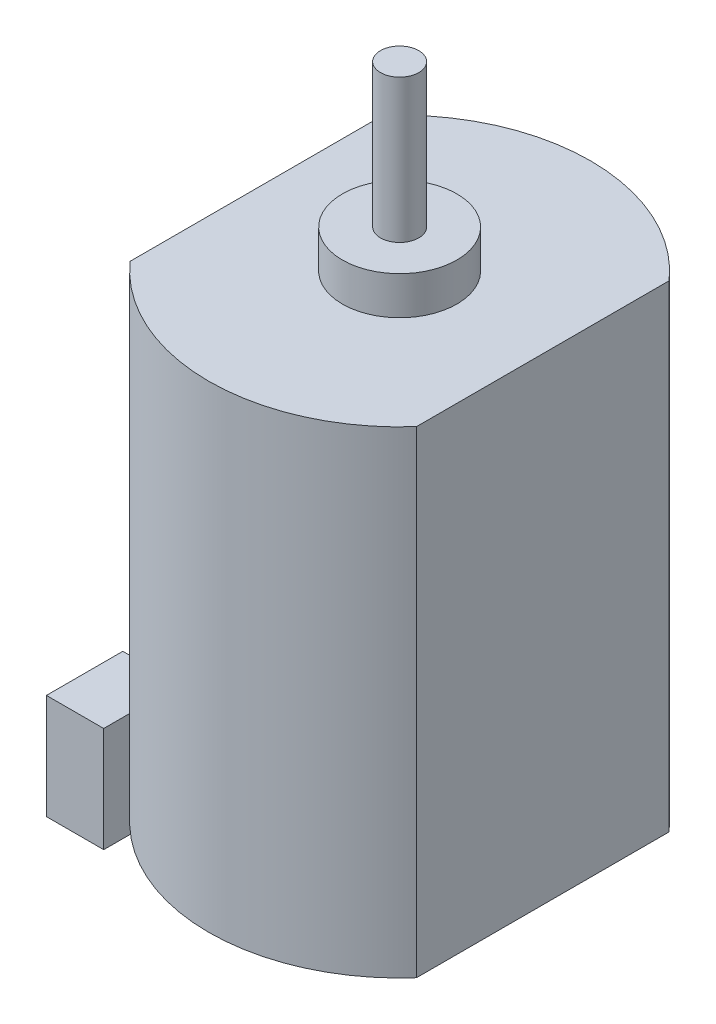
ISO-10303-21;
HEADER;
FILE_DESCRIPTION(('STEP AP214'),'2;1');
FILE_NAME('part.step','',(''),(''),'','','');
FILE_SCHEMA(('AUTOMOTIVE_DESIGN { 1 0 10303 214 1 1 1 1 }'));
ENDSEC;
DATA;
#1=APPLICATION_CONTEXT('core data for automotive mechanical design processes');
#2=APPLICATION_PROTOCOL_DEFINITION('international standard','automotive_design',2000,#1);
#3=PRODUCT_CONTEXT('',#1,'mechanical');
#4=PRODUCT('Part','Part','',(#3));
#5=PRODUCT_RELATED_PRODUCT_CATEGORY('part','',(#4));
#6=PRODUCT_DEFINITION_FORMATION('','',#4);
#7=PRODUCT_DEFINITION_CONTEXT('part definition',#1,'design');
#8=PRODUCT_DEFINITION('design','',#6,#7);
#9=PRODUCT_DEFINITION_SHAPE('','',#8);
#10=(LENGTH_UNIT() NAMED_UNIT(*) SI_UNIT(.MILLI.,.METRE.));
#11=(NAMED_UNIT(*) PLANE_ANGLE_UNIT() SI_UNIT($,.RADIAN.));
#12=(NAMED_UNIT(*) SI_UNIT($,.STERADIAN.) SOLID_ANGLE_UNIT());
#13=UNCERTAINTY_MEASURE_WITH_UNIT(LENGTH_MEASURE(1.E-05),#10,'distance_accuracy_value','');
#14=(GEOMETRIC_REPRESENTATION_CONTEXT(3) GLOBAL_UNCERTAINTY_ASSIGNED_CONTEXT((#13)) GLOBAL_UNIT_ASSIGNED_CONTEXT((#10,
#11,#12)) REPRESENTATION_CONTEXT('',''));
#15=CARTESIAN_POINT('',(0.,0.,0.));
#16=DIRECTION('',(0.,0.,1.));
#17=DIRECTION('',(1.,0.,0.));
#18=AXIS2_PLACEMENT_3D('',#15,#16,#17);
#19=CARTESIAN_POINT('',(-7.5,25.001,10.));
#20=DIRECTION('',(1.,0.,0.));
#21=DIRECTION('',(0.,0.,-1.));
#22=AXIS2_PLACEMENT_3D('',#19,#20,#21);
#23=PLANE('',#22);
#24=DIRECTION('',(0.,0.,-1.));
#25=VECTOR('',#24,1.);
#26=CARTESIAN_POINT('',(-7.5,4.5,4.));
#27=LINE('',#26,#25);
#28=CARTESIAN_POINT('',(-7.5,4.5,6.61437827766148));
#29=VERTEX_POINT('',#28);
#30=CARTESIAN_POINT('',(-7.5,4.5,4.));
#31=VERTEX_POINT('',#30);
#32=EDGE_CURVE('E53',#29,#31,#27,.T.);
#33=ORIENTED_EDGE('',*,*,#32,.F.);
#34=DIRECTION('',(0.,-1.,0.));
#35=VECTOR('',#34,1.);
#36=CARTESIAN_POINT('',(-7.5,25.,6.61437827766148));
#37=LINE('',#36,#35);
#38=CARTESIAN_POINT('',(-7.5,25.,6.61437827766148));
#39=VERTEX_POINT('',#38);
#40=EDGE_CURVE('E237',#29,#39,#37,.F.);
#41=ORIENTED_EDGE('',*,*,#40,.T.);
#42=DIRECTION('',(0.,0.,1.));
#43=VECTOR('',#42,1.);
#44=CARTESIAN_POINT('',(-7.5,25.,10.));
#45=LINE('',#44,#43);
#46=CARTESIAN_POINT('',(-7.5,25.,-6.61437827766148));
#47=VERTEX_POINT('',#46);
#48=EDGE_CURVE('E242',#47,#39,#45,.T.);
#49=ORIENTED_EDGE('',*,*,#48,.F.);
#50=DIRECTION('',(0.,-1.,0.));
#51=VECTOR('',#50,1.);
#52=CARTESIAN_POINT('',(-7.5,25.,-6.61437827766148));
#53=LINE('',#52,#51);
#54=CARTESIAN_POINT('',(-7.5,4.5,-6.61437827766148));
#55=VERTEX_POINT('',#54);
#56=EDGE_CURVE('E234',#47,#55,#53,.T.);
#57=ORIENTED_EDGE('',*,*,#56,.T.);
#58=DIRECTION('',(0.,0.,-1.));
#59=VECTOR('',#58,1.);
#60=CARTESIAN_POINT('',(-7.5,4.5,-8.));
#61=LINE('',#60,#59);
#62=CARTESIAN_POINT('',(-7.5,4.5,-4.));
#63=VERTEX_POINT('',#62);
#64=EDGE_CURVE('E192',#63,#55,#61,.T.);
#65=ORIENTED_EDGE('',*,*,#64,.F.);
#66=DIRECTION('',(0.,1.,0.));
#67=VECTOR('',#66,1.);
#68=CARTESIAN_POINT('',(-7.5,4.5,-4.));
#69=LINE('',#68,#67);
#70=CARTESIAN_POINT('',(-7.5,0.,-4.));
#71=VERTEX_POINT('',#70);
#72=EDGE_CURVE('E11',#71,#63,#69,.T.);
#73=ORIENTED_EDGE('',*,*,#72,.F.);
#74=DIRECTION('',(0.,0.,1.));
#75=VECTOR('',#74,1.);
#76=CARTESIAN_POINT('',(-7.5,0.,10.));
#77=LINE('',#76,#75);
#78=CARTESIAN_POINT('',(-7.5,0.,4.));
#79=VERTEX_POINT('',#78);
#80=EDGE_CURVE('E250',#71,#79,#77,.T.);
#81=ORIENTED_EDGE('',*,*,#80,.T.);
#82=DIRECTION('',(0.,-1.,0.));
#83=VECTOR('',#82,1.);
#84=CARTESIAN_POINT('',(-7.5,3.,4.));
#85=LINE('',#84,#83);
#86=EDGE_CURVE('E49',#31,#79,#85,.T.);
#87=ORIENTED_EDGE('',*,*,#86,.F.);
#88=EDGE_LOOP('',(#33,#41,#49,#57,#65,#73,#81,#87));
#89=FACE_BOUND('',#88,.T.);
#90=ADVANCED_FACE('F32',(#89),#23,.F.);
#91=CARTESIAN_POINT('',(0.,25.,0.));
#92=DIRECTION('',(0.,-1.,0.));
#93=DIRECTION('',(0.,0.,-1.));
#94=AXIS2_PLACEMENT_3D('',#91,#92,#93);
#95=CYLINDRICAL_SURFACE('',#94,10.);
#96=CARTESIAN_POINT('',(0.,25.,0.));
#97=DIRECTION('',(0.,1.,0.));
#98=DIRECTION('',(0.,0.,1.));
#99=AXIS2_PLACEMENT_3D('',#96,#97,#98);
#100=CIRCLE('',#99,10.);
#101=CARTESIAN_POINT('',(7.5,25.,6.61437827766148));
#102=VERTEX_POINT('',#101);
#103=EDGE_CURVE('E259',#39,#102,#100,.T.);
#104=ORIENTED_EDGE('',*,*,#103,.F.);
#105=ORIENTED_EDGE('',*,*,#40,.F.);
#106=CARTESIAN_POINT('',(-7.5,0.,6.61437827766148));
#107=VERTEX_POINT('',#106);
#108=EDGE_CURVE('E239',#107,#29,#37,.F.);
#109=ORIENTED_EDGE('',*,*,#108,.F.);
#110=CARTESIAN_POINT('',(0.,0.,0.));
#111=DIRECTION('',(0.,1.,0.));
#112=DIRECTION('',(0.,0.,1.));
#113=AXIS2_PLACEMENT_3D('',#110,#111,#112);
#114=CIRCLE('',#113,10.);
#115=CARTESIAN_POINT('',(7.5,0.,6.61437827766148));
#116=VERTEX_POINT('',#115);
#117=EDGE_CURVE('E249',#107,#116,#114,.T.);
#118=ORIENTED_EDGE('',*,*,#117,.T.);
#119=DIRECTION('',(0.,-1.,0.));
#120=VECTOR('',#119,1.);
#121=CARTESIAN_POINT('',(7.5,25.,6.61437827766148));
#122=LINE('',#121,#120);
#123=EDGE_CURVE('E228',#102,#116,#122,.T.);
#124=ORIENTED_EDGE('',*,*,#123,.F.);
#125=EDGE_LOOP('',(#104,#105,#109,#118,#124));
#126=FACE_BOUND('',#125,.T.);
#127=ADVANCED_FACE('F300',(#126),#95,.T.);
#128=CARTESIAN_POINT('',(7.5,0.,-6.61437827766148));
#129=VERTEX_POINT('',#128);
#130=CARTESIAN_POINT('',(-7.5,0.,-6.61437827766148));
#131=VERTEX_POINT('',#130);
#132=EDGE_CURVE('E262',#129,#131,#114,.T.);
#133=ORIENTED_EDGE('',*,*,#132,.T.);
#134=EDGE_CURVE('E238',#55,#131,#53,.T.);
#135=ORIENTED_EDGE('',*,*,#134,.F.);
#136=ORIENTED_EDGE('',*,*,#56,.F.);
#137=CARTESIAN_POINT('',(7.5,25.,-6.61437827766148));
#138=VERTEX_POINT('',#137);
#139=EDGE_CURVE('E233',#138,#47,#100,.T.);
#140=ORIENTED_EDGE('',*,*,#139,.F.);
#141=DIRECTION('',(0.,-1.,0.));
#142=VECTOR('',#141,1.);
#143=CARTESIAN_POINT('',(7.5,25.,-6.61437827766148));
#144=LINE('',#143,#142);
#145=EDGE_CURVE('E252',#129,#138,#144,.F.);
#146=ORIENTED_EDGE('',*,*,#145,.F.);
#147=EDGE_LOOP('',(#133,#135,#136,#140,#146));
#148=FACE_BOUND('',#147,.T.);
#149=ADVANCED_FACE('F34',(#148),#95,.T.);
#150=CARTESIAN_POINT('',(0.,25.,0.));
#151=DIRECTION('',(0.,1.,0.));
#152=DIRECTION('',(0.,0.,1.));
#153=AXIS2_PLACEMENT_3D('',#150,#151,#152);
#154=PLANE('',#153);
#155=ORIENTED_EDGE('',*,*,#48,.T.);
#156=ORIENTED_EDGE('',*,*,#103,.T.);
#157=DIRECTION('',(0.,0.,-1.));
#158=VECTOR('',#157,1.);
#159=CARTESIAN_POINT('',(7.5,25.,10.));
#160=LINE('',#159,#158);
#161=EDGE_CURVE('E254',#102,#138,#160,.T.);
#162=ORIENTED_EDGE('',*,*,#161,.T.);
#163=ORIENTED_EDGE('',*,*,#139,.T.);
#164=EDGE_LOOP('',(#155,#156,#162,#163));
#165=FACE_BOUND('',#164,.T.);
#166=CARTESIAN_POINT('',(0.,25.,0.));
#167=DIRECTION('',(0.,1.,0.));
#168=DIRECTION('',(0.,0.,1.));
#169=AXIS2_PLACEMENT_3D('',#166,#167,#168);
#170=CIRCLE('',#169,3.);
#171=CARTESIAN_POINT('',(0.,25.,3.));
#172=VERTEX_POINT('',#171);
#173=EDGE_CURVE('E229',#172,#172,#170,.T.);
#174=ORIENTED_EDGE('',*,*,#173,.F.);
#175=EDGE_LOOP('',(#174));
#176=FACE_BOUND('',#175,.T.);
#177=ADVANCED_FACE('F291',(#165,#176),#154,.T.);
#178=CARTESIAN_POINT('',(0.,0.,0.));
#179=DIRECTION('',(0.,1.,0.));
#180=DIRECTION('',(0.,0.,1.));
#181=AXIS2_PLACEMENT_3D('',#178,#179,#180);
#182=PLANE('',#181);
#183=DIRECTION('',(0.,0.,-1.));
#184=VECTOR('',#183,1.);
#185=CARTESIAN_POINT('',(4.,0.,0.));
#186=LINE('',#185,#184);
#187=CARTESIAN_POINT('',(4.,0.,3.));
#188=VERTEX_POINT('',#187);
#189=CARTESIAN_POINT('',(4.,0.,-3.));
#190=VERTEX_POINT('',#189);
#191=EDGE_CURVE('E232',#188,#190,#186,.T.);
#192=ORIENTED_EDGE('',*,*,#191,.T.);
#193=CARTESIAN_POINT('',(0.,0.,0.));
#194=DIRECTION('',(0.,1.,0.));
#195=DIRECTION('',(0.,0.,1.));
#196=AXIS2_PLACEMENT_3D('',#193,#194,#195);
#197=CIRCLE('',#196,5.);
#198=EDGE_CURVE('E268',#190,#188,#197,.T.);
#199=ORIENTED_EDGE('',*,*,#198,.T.);
#200=EDGE_LOOP('',(#192,#199));
#201=FACE_BOUND('',#200,.T.);
#202=ORIENTED_EDGE('',*,*,#117,.F.);
#203=EDGE_CURVE('E245',#79,#107,#77,.T.);
#204=ORIENTED_EDGE('',*,*,#203,.F.);
#205=ORIENTED_EDGE('',*,*,#80,.F.);
#206=EDGE_CURVE('E246',#131,#71,#77,.T.);
#207=ORIENTED_EDGE('',*,*,#206,.F.);
#208=ORIENTED_EDGE('',*,*,#132,.F.);
#209=DIRECTION('',(0.,0.,-1.));
#210=VECTOR('',#209,1.);
#211=CARTESIAN_POINT('',(7.5,0.,10.));
#212=LINE('',#211,#210);
#213=EDGE_CURVE('E257',#116,#129,#212,.T.);
#214=ORIENTED_EDGE('',*,*,#213,.F.);
#215=EDGE_LOOP('',(#202,#204,#205,#207,#208,#214));
#216=FACE_BOUND('',#215,.T.);
#217=ADVANCED_FACE('F287',(#201,#216),#182,.F.);
#218=CARTESIAN_POINT('',(7.5,25.001,10.));
#219=DIRECTION('',(-1.,0.,0.));
#220=DIRECTION('',(0.,0.,1.));
#221=AXIS2_PLACEMENT_3D('',#218,#219,#220);
#222=PLANE('',#221);
#223=ORIENTED_EDGE('',*,*,#145,.T.);
#224=ORIENTED_EDGE('',*,*,#161,.F.);
#225=ORIENTED_EDGE('',*,*,#123,.T.);
#226=ORIENTED_EDGE('',*,*,#213,.T.);
#227=EDGE_LOOP('',(#223,#224,#225,#226));
#228=FACE_BOUND('',#227,.T.);
#229=ADVANCED_FACE('F290',(#228),#222,.F.);
#230=CARTESIAN_POINT('',(0.,27.,0.));
#231=DIRECTION('',(0.,-1.,0.));
#232=DIRECTION('',(0.,0.,-1.));
#233=AXIS2_PLACEMENT_3D('',#230,#231,#232);
#234=CYLINDRICAL_SURFACE('',#233,3.);
#235=CARTESIAN_POINT('',(0.,27.,0.));
#236=DIRECTION('',(0.,1.,0.));
#237=DIRECTION('',(0.,0.,1.));
#238=AXIS2_PLACEMENT_3D('',#235,#236,#237);
#239=CIRCLE('',#238,3.);
#240=CARTESIAN_POINT('',(0.,27.,3.));
#241=VERTEX_POINT('',#240);
#242=EDGE_CURVE('E225',#241,#241,#239,.T.);
#243=ORIENTED_EDGE('',*,*,#242,.F.);
#244=EDGE_LOOP('',(#243));
#245=FACE_BOUND('',#244,.T.);
#246=ORIENTED_EDGE('',*,*,#173,.T.);
#247=EDGE_LOOP('',(#246));
#248=FACE_BOUND('',#247,.T.);
#249=ADVANCED_FACE('F337',(#245,#248),#234,.T.);
#250=CARTESIAN_POINT('',(0.,27.,0.));
#251=DIRECTION('',(0.,1.,0.));
#252=DIRECTION('',(0.,0.,1.));
#253=AXIS2_PLACEMENT_3D('',#250,#251,#252);
#254=PLANE('',#253);
#255=CARTESIAN_POINT('',(0.,27.,0.));
#256=DIRECTION('',(0.,1.,0.));
#257=DIRECTION('',(0.,0.,1.));
#258=AXIS2_PLACEMENT_3D('',#255,#256,#257);
#259=CIRCLE('',#258,1.);
#260=CARTESIAN_POINT('',(0.,27.,1.));
#261=VERTEX_POINT('',#260);
#262=EDGE_CURVE('E224',#261,#261,#259,.F.);
#263=ORIENTED_EDGE('',*,*,#262,.T.);
#264=EDGE_LOOP('',(#263));
#265=FACE_BOUND('',#264,.T.);
#266=ORIENTED_EDGE('',*,*,#242,.T.);
#267=EDGE_LOOP('',(#266));
#268=FACE_BOUND('',#267,.T.);
#269=ADVANCED_FACE('F342',(#265,#268),#254,.T.);
#270=CARTESIAN_POINT('',(0.,34.5,0.));
#271=DIRECTION('',(0.,-1.,0.));
#272=DIRECTION('',(0.,0.,-1.));
#273=AXIS2_PLACEMENT_3D('',#270,#271,#272);
#274=CYLINDRICAL_SURFACE('',#273,1.);
#275=ORIENTED_EDGE('',*,*,#262,.F.);
#276=EDGE_LOOP('',(#275));
#277=FACE_BOUND('',#276,.T.);
#278=CARTESIAN_POINT('',(0.,34.5,0.));
#279=DIRECTION('',(0.,1.,0.));
#280=DIRECTION('',(0.,0.,1.));
#281=AXIS2_PLACEMENT_3D('',#278,#279,#280);
#282=CIRCLE('',#281,1.);
#283=CARTESIAN_POINT('',(0.,34.5,1.));
#284=VERTEX_POINT('',#283);
#285=EDGE_CURVE('E219',#284,#284,#282,.T.);
#286=ORIENTED_EDGE('',*,*,#285,.F.);
#287=EDGE_LOOP('',(#286));
#288=FACE_BOUND('',#287,.T.);
#289=ADVANCED_FACE('F354',(#277,#288),#274,.T.);
#290=CARTESIAN_POINT('',(0.,34.5,0.));
#291=DIRECTION('',(0.,1.,0.));
#292=DIRECTION('',(0.,0.,1.));
#293=AXIS2_PLACEMENT_3D('',#290,#291,#292);
#294=PLANE('',#293);
#295=ORIENTED_EDGE('',*,*,#285,.T.);
#296=EDGE_LOOP('',(#295));
#297=FACE_BOUND('',#296,.T.);
#298=ADVANCED_FACE('F358',(#297),#294,.T.);
#299=CARTESIAN_POINT('',(0.,-2.3,0.));
#300=DIRECTION('',(0.,1.,0.));
#301=DIRECTION('',(0.,0.,1.));
#302=AXIS2_PLACEMENT_3D('',#299,#300,#301);
#303=CYLINDRICAL_SURFACE('',#302,5.);
#304=ORIENTED_EDGE('',*,*,#198,.F.);
#305=DIRECTION('',(0.,1.,0.));
#306=VECTOR('',#305,1.);
#307=CARTESIAN_POINT('',(4.,-2.3,-3.));
#308=LINE('',#307,#306);
#309=CARTESIAN_POINT('',(4.,-2.3,-3.));
#310=VERTEX_POINT('',#309);
#311=EDGE_CURVE('E217',#310,#190,#308,.T.);
#312=ORIENTED_EDGE('',*,*,#311,.F.);
#313=CARTESIAN_POINT('',(0.,-2.3,0.));
#314=DIRECTION('',(0.,1.,0.));
#315=DIRECTION('',(0.,0.,1.));
#316=AXIS2_PLACEMENT_3D('',#313,#314,#315);
#317=CIRCLE('',#316,5.);
#318=CARTESIAN_POINT('',(4.,-2.3,3.));
#319=VERTEX_POINT('',#318);
#320=EDGE_CURVE('E210',#310,#319,#317,.T.);
#321=ORIENTED_EDGE('',*,*,#320,.T.);
#322=DIRECTION('',(0.,1.,0.));
#323=VECTOR('',#322,1.);
#324=CARTESIAN_POINT('',(4.,-2.3,3.));
#325=LINE('',#324,#323);
#326=EDGE_CURVE('E216',#319,#188,#325,.T.);
#327=ORIENTED_EDGE('',*,*,#326,.T.);
#328=EDGE_LOOP('',(#304,#312,#321,#327));
#329=FACE_BOUND('',#328,.T.);
#330=ADVANCED_FACE('F286',(#329),#303,.T.);
#331=CARTESIAN_POINT('',(4.,-2.3,0.));
#332=DIRECTION('',(1.,0.,0.));
#333=DIRECTION('',(0.,0.,-1.));
#334=AXIS2_PLACEMENT_3D('',#331,#332,#333);
#335=PLANE('',#334);
#336=ORIENTED_EDGE('',*,*,#191,.F.);
#337=ORIENTED_EDGE('',*,*,#326,.F.);
#338=DIRECTION('',(0.,0.,-1.));
#339=VECTOR('',#338,1.);
#340=CARTESIAN_POINT('',(4.,-2.3,0.));
#341=LINE('',#340,#339);
#342=EDGE_CURVE('E213',#319,#310,#341,.T.);
#343=ORIENTED_EDGE('',*,*,#342,.T.);
#344=ORIENTED_EDGE('',*,*,#311,.T.);
#345=EDGE_LOOP('',(#336,#337,#343,#344));
#346=FACE_BOUND('',#345,.T.);
#347=ADVANCED_FACE('F280',(#346),#335,.T.);
#348=CARTESIAN_POINT('',(0.,-2.3,0.));
#349=DIRECTION('',(0.,1.,0.));
#350=DIRECTION('',(0.,0.,1.));
#351=AXIS2_PLACEMENT_3D('',#348,#349,#350);
#352=PLANE('',#351);
#353=CARTESIAN_POINT('',(0.,-2.3,0.));
#354=DIRECTION('',(0.,1.,0.));
#355=DIRECTION('',(0.,0.,1.));
#356=AXIS2_PLACEMENT_3D('',#353,#354,#355);
#357=CIRCLE('',#356,1.);
#358=CARTESIAN_POINT('',(0.,-2.3,1.));
#359=VERTEX_POINT('',#358);
#360=EDGE_CURVE('E36',#359,#359,#357,.F.);
#361=ORIENTED_EDGE('',*,*,#360,.F.);
#362=EDGE_LOOP('',(#361));
#363=FACE_BOUND('',#362,.T.);
#364=ORIENTED_EDGE('',*,*,#320,.F.);
#365=ORIENTED_EDGE('',*,*,#342,.F.);
#366=EDGE_LOOP('',(#364,#365));
#367=FACE_BOUND('',#366,.T.);
#368=ADVANCED_FACE('F277',(#363,#367),#352,.F.);
#369=CARTESIAN_POINT('',(0.,-3.3,0.));
#370=DIRECTION('',(0.,1.,0.));
#371=DIRECTION('',(0.,0.,1.));
#372=AXIS2_PLACEMENT_3D('',#369,#370,#371);
#373=CYLINDRICAL_SURFACE('',#372,1.);
#374=CARTESIAN_POINT('',(0.,-3.3,0.));
#375=DIRECTION('',(0.,-1.,0.));
#376=DIRECTION('',(0.,0.,-1.));
#377=AXIS2_PLACEMENT_3D('',#374,#375,#376);
#378=CIRCLE('',#377,1.);
#379=CARTESIAN_POINT('',(0.,-3.3,-1.));
#380=VERTEX_POINT('',#379);
#381=EDGE_CURVE('E207',#380,#380,#378,.T.);
#382=ORIENTED_EDGE('',*,*,#381,.F.);
#383=EDGE_LOOP('',(#382));
#384=FACE_BOUND('',#383,.T.);
#385=ORIENTED_EDGE('',*,*,#360,.T.);
#386=EDGE_LOOP('',(#385));
#387=FACE_BOUND('',#386,.T.);
#388=ADVANCED_FACE('F275',(#384,#387),#373,.T.);
#389=CARTESIAN_POINT('',(0.,-3.3,0.));
#390=DIRECTION('',(0.,-1.,0.));
#391=DIRECTION('',(0.,0.,-1.));
#392=AXIS2_PLACEMENT_3D('',#389,#390,#391);
#393=PLANE('',#392);
#394=ORIENTED_EDGE('',*,*,#381,.T.);
#395=EDGE_LOOP('',(#394));
#396=FACE_BOUND('',#395,.T.);
#397=ADVANCED_FACE('F369',(#396),#393,.T.);
#398=CARTESIAN_POINT('',(-7.5,0.,0.));
#399=DIRECTION('',(-1.,0.,0.));
#400=DIRECTION('',(0.,0.,1.));
#401=AXIS2_PLACEMENT_3D('',#398,#399,#400);
#402=PLANE('',#401);
#403=CARTESIAN_POINT('',(-7.5,4.5,-8.));
#404=VERTEX_POINT('',#403);
#405=EDGE_CURVE('E191',#55,#404,#61,.T.);
#406=ORIENTED_EDGE('',*,*,#405,.F.);
#407=ORIENTED_EDGE('',*,*,#134,.T.);
#408=ORIENTED_EDGE('',*,*,#206,.T.);
#409=CARTESIAN_POINT('',(-7.5,-1.,-4.));
#410=VERTEX_POINT('',#409);
#411=EDGE_CURVE('E42',#410,#71,#69,.T.);
#412=ORIENTED_EDGE('',*,*,#411,.F.);
#413=DIRECTION('',(0.,0.,1.));
#414=VECTOR('',#413,1.);
#415=CARTESIAN_POINT('',(-7.5,-1.,-8.));
#416=LINE('',#415,#414);
#417=CARTESIAN_POINT('',(-7.5,-1.,-8.));
#418=VERTEX_POINT('',#417);
#419=EDGE_CURVE('E170',#418,#410,#416,.T.);
#420=ORIENTED_EDGE('',*,*,#419,.F.);
#421=DIRECTION('',(0.,-1.,0.));
#422=VECTOR('',#421,1.);
#423=CARTESIAN_POINT('',(-7.5,3.,-8.));
#424=LINE('',#423,#422);
#425=EDGE_CURVE('E182',#404,#418,#424,.T.);
#426=ORIENTED_EDGE('',*,*,#425,.F.);
#427=EDGE_LOOP('',(#406,#407,#408,#412,#420,#426));
#428=FACE_BOUND('',#427,.T.);
#429=ADVANCED_FACE('F311',(#428),#402,.F.);
#430=CARTESIAN_POINT('',(-10.5,-1.,-8.));
#431=DIRECTION('',(0.,1.,0.));
#432=DIRECTION('',(0.,0.,1.));
#433=AXIS2_PLACEMENT_3D('',#430,#431,#432);
#434=PLANE('',#433);
#435=ORIENTED_EDGE('',*,*,#419,.T.);
#436=DIRECTION('',(1.,0.,0.));
#437=VECTOR('',#436,1.);
#438=CARTESIAN_POINT('',(-10.5,-1.,-4.));
#439=LINE('',#438,#437);
#440=CARTESIAN_POINT('',(-10.5,-1.,-4.));
#441=VERTEX_POINT('',#440);
#442=EDGE_CURVE('E201',#441,#410,#439,.T.);
#443=ORIENTED_EDGE('',*,*,#442,.F.);
#444=DIRECTION('',(0.,0.,1.));
#445=VECTOR('',#444,1.);
#446=CARTESIAN_POINT('',(-10.5,-1.,-8.));
#447=LINE('',#446,#445);
#448=CARTESIAN_POINT('',(-10.5,-1.,-8.));
#449=VERTEX_POINT('',#448);
#450=EDGE_CURVE('E181',#449,#441,#447,.T.);
#451=ORIENTED_EDGE('',*,*,#450,.F.);
#452=DIRECTION('',(1.,0.,0.));
#453=VECTOR('',#452,1.);
#454=CARTESIAN_POINT('',(-10.5,-1.,-8.));
#455=LINE('',#454,#453);
#456=EDGE_CURVE('E204',#449,#418,#455,.T.);
#457=ORIENTED_EDGE('',*,*,#456,.T.);
#458=EDGE_LOOP('',(#435,#443,#451,#457));
#459=FACE_BOUND('',#458,.T.);
#460=ADVANCED_FACE('F319',(#459),#434,.F.);
#461=CARTESIAN_POINT('',(-10.5,4.5,-4.));
#462=DIRECTION('',(0.,0.,-1.));
#463=DIRECTION('',(0.,1.,0.));
#464=AXIS2_PLACEMENT_3D('',#461,#462,#463);
#465=PLANE('',#464);
#466=ORIENTED_EDGE('',*,*,#411,.T.);
#467=ORIENTED_EDGE('',*,*,#72,.T.);
#468=DIRECTION('',(1.,0.,0.));
#469=VECTOR('',#468,1.);
#470=CARTESIAN_POINT('',(-10.5,4.5,-4.));
#471=LINE('',#470,#469);
#472=CARTESIAN_POINT('',(-10.5,4.5,-4.));
#473=VERTEX_POINT('',#472);
#474=EDGE_CURVE('E198',#473,#63,#471,.T.);
#475=ORIENTED_EDGE('',*,*,#474,.F.);
#476=DIRECTION('',(0.,1.,0.));
#477=VECTOR('',#476,1.);
#478=CARTESIAN_POINT('',(-10.5,3.,-4.));
#479=LINE('',#478,#477);
#480=EDGE_CURVE('E184',#441,#473,#479,.T.);
#481=ORIENTED_EDGE('',*,*,#480,.F.);
#482=ORIENTED_EDGE('',*,*,#442,.T.);
#483=EDGE_LOOP('',(#466,#467,#475,#481,#482));
#484=FACE_BOUND('',#483,.T.);
#485=ADVANCED_FACE('F314',(#484),#465,.F.);
#486=CARTESIAN_POINT('',(-10.5,4.5,-8.));
#487=DIRECTION('',(0.,-1.,0.));
#488=DIRECTION('',(0.,0.,-1.));
#489=AXIS2_PLACEMENT_3D('',#486,#487,#488);
#490=PLANE('',#489);
#491=ORIENTED_EDGE('',*,*,#64,.T.);
#492=ORIENTED_EDGE('',*,*,#405,.T.);
#493=DIRECTION('',(1.,0.,0.));
#494=VECTOR('',#493,1.);
#495=CARTESIAN_POINT('',(-10.5,4.5,-8.));
#496=LINE('',#495,#494);
#497=CARTESIAN_POINT('',(-10.5,4.5,-8.));
#498=VERTEX_POINT('',#497);
#499=EDGE_CURVE('E188',#498,#404,#496,.T.);
#500=ORIENTED_EDGE('',*,*,#499,.F.);
#501=DIRECTION('',(0.,0.,-1.));
#502=VECTOR('',#501,1.);
#503=CARTESIAN_POINT('',(-10.5,4.5,-8.));
#504=LINE('',#503,#502);
#505=EDGE_CURVE('E186',#473,#498,#504,.T.);
#506=ORIENTED_EDGE('',*,*,#505,.F.);
#507=ORIENTED_EDGE('',*,*,#474,.T.);
#508=EDGE_LOOP('',(#491,#492,#500,#506,#507));
#509=FACE_BOUND('',#508,.T.);
#510=ADVANCED_FACE('F327',(#509),#490,.F.);
#511=CARTESIAN_POINT('',(-10.5,3.,-8.));
#512=DIRECTION('',(0.,0.,1.));
#513=DIRECTION('',(1.,0.,0.));
#514=AXIS2_PLACEMENT_3D('',#511,#512,#513);
#515=PLANE('',#514);
#516=ORIENTED_EDGE('',*,*,#425,.T.);
#517=ORIENTED_EDGE('',*,*,#456,.F.);
#518=DIRECTION('',(0.,-1.,0.));
#519=VECTOR('',#518,1.);
#520=CARTESIAN_POINT('',(-10.5,3.,-8.));
#521=LINE('',#520,#519);
#522=EDGE_CURVE('E178',#498,#449,#521,.T.);
#523=ORIENTED_EDGE('',*,*,#522,.F.);
#524=ORIENTED_EDGE('',*,*,#499,.T.);
#525=EDGE_LOOP('',(#516,#517,#523,#524));
#526=FACE_BOUND('',#525,.T.);
#527=ADVANCED_FACE('F323',(#526),#515,.F.);
#528=CARTESIAN_POINT('',(-10.5,0.,0.));
#529=DIRECTION('',(-1.,0.,0.));
#530=DIRECTION('',(0.,0.,1.));
#531=AXIS2_PLACEMENT_3D('',#528,#529,#530);
#532=PLANE('',#531);
#533=ORIENTED_EDGE('',*,*,#522,.T.);
#534=ORIENTED_EDGE('',*,*,#450,.T.);
#535=ORIENTED_EDGE('',*,*,#480,.T.);
#536=ORIENTED_EDGE('',*,*,#505,.T.);
#537=EDGE_LOOP('',(#533,#534,#535,#536));
#538=FACE_BOUND('',#537,.T.);
#539=ADVANCED_FACE('F382',(#538),#532,.T.);
#540=CARTESIAN_POINT('',(-7.5,0.,0.));
#541=DIRECTION('',(1.,0.,0.));
#542=DIRECTION('',(0.,0.,-1.));
#543=AXIS2_PLACEMENT_3D('',#540,#541,#542);
#544=PLANE('',#543);
#545=ORIENTED_EDGE('',*,*,#108,.T.);
#546=CARTESIAN_POINT('',(-7.5,4.5,8.));
#547=VERTEX_POINT('',#546);
#548=EDGE_CURVE('E578',#547,#29,#27,.T.);
#549=ORIENTED_EDGE('',*,*,#548,.F.);
#550=DIRECTION('',(0.,1.,0.));
#551=VECTOR('',#550,1.);
#552=CARTESIAN_POINT('',(-7.5,4.5,8.));
#553=LINE('',#552,#551);
#554=CARTESIAN_POINT('',(-7.5,-1.,8.));
#555=VERTEX_POINT('',#554);
#556=EDGE_CURVE('E586',#555,#547,#553,.T.);
#557=ORIENTED_EDGE('',*,*,#556,.F.);
#558=DIRECTION('',(0.,0.,1.));
#559=VECTOR('',#558,1.);
#560=CARTESIAN_POINT('',(-7.5,-1.,4.));
#561=LINE('',#560,#559);
#562=CARTESIAN_POINT('',(-7.5,-1.,4.));
#563=VERTEX_POINT('',#562);
#564=EDGE_CURVE('E169',#563,#555,#561,.T.);
#565=ORIENTED_EDGE('',*,*,#564,.F.);
#566=EDGE_CURVE('E306',#79,#563,#85,.T.);
#567=ORIENTED_EDGE('',*,*,#566,.F.);
#568=ORIENTED_EDGE('',*,*,#203,.T.);
#569=EDGE_LOOP('',(#545,#549,#557,#565,#567,#568));
#570=FACE_BOUND('',#569,.T.);
#571=ADVANCED_FACE('F305',(#570),#544,.T.);
#572=CARTESIAN_POINT('',(-10.5,-1.,4.));
#573=DIRECTION('',(0.,1.,0.));
#574=DIRECTION('',(0.,0.,1.));
#575=AXIS2_PLACEMENT_3D('',#572,#573,#574);
#576=PLANE('',#575);
#577=ORIENTED_EDGE('',*,*,#564,.T.);
#578=DIRECTION('',(1.,0.,0.));
#579=VECTOR('',#578,1.);
#580=CARTESIAN_POINT('',(-10.5,-1.,8.));
#581=LINE('',#580,#579);
#582=CARTESIAN_POINT('',(-10.5,-1.,8.));
#583=VERTEX_POINT('',#582);
#584=EDGE_CURVE('E150',#583,#555,#581,.T.);
#585=ORIENTED_EDGE('',*,*,#584,.F.);
#586=DIRECTION('',(0.,0.,1.));
#587=VECTOR('',#586,1.);
#588=CARTESIAN_POINT('',(-10.5,-1.,4.));
#589=LINE('',#588,#587);
#590=CARTESIAN_POINT('',(-10.5,-1.,4.));
#591=VERTEX_POINT('',#590);
#592=EDGE_CURVE('E157',#591,#583,#589,.T.);
#593=ORIENTED_EDGE('',*,*,#592,.F.);
#594=DIRECTION('',(1.,0.,0.));
#595=VECTOR('',#594,1.);
#596=CARTESIAN_POINT('',(-10.5,-1.,4.));
#597=LINE('',#596,#595);
#598=EDGE_CURVE('E582',#591,#563,#597,.T.);
#599=ORIENTED_EDGE('',*,*,#598,.T.);
#600=EDGE_LOOP('',(#577,#585,#593,#599));
#601=FACE_BOUND('',#600,.T.);
#602=ADVANCED_FACE('F167',(#601),#576,.F.);
#603=CARTESIAN_POINT('',(-10.5,4.5,8.));
#604=DIRECTION('',(0.,0.,-1.));
#605=DIRECTION('',(-1.,0.,0.));
#606=AXIS2_PLACEMENT_3D('',#603,#604,#605);
#607=PLANE('',#606);
#608=ORIENTED_EDGE('',*,*,#556,.T.);
#609=DIRECTION('',(1.,0.,0.));
#610=VECTOR('',#609,1.);
#611=CARTESIAN_POINT('',(-10.5,4.5,8.));
#612=LINE('',#611,#610);
#613=CARTESIAN_POINT('',(-10.5,4.5,8.));
#614=VERTEX_POINT('',#613);
#615=EDGE_CURVE('E153',#614,#547,#612,.T.);
#616=ORIENTED_EDGE('',*,*,#615,.F.);
#617=DIRECTION('',(0.,1.,0.));
#618=VECTOR('',#617,1.);
#619=CARTESIAN_POINT('',(-10.5,3.,8.));
#620=LINE('',#619,#618);
#621=EDGE_CURVE('E146',#583,#614,#620,.T.);
#622=ORIENTED_EDGE('',*,*,#621,.F.);
#623=ORIENTED_EDGE('',*,*,#584,.T.);
#624=EDGE_LOOP('',(#608,#616,#622,#623));
#625=FACE_BOUND('',#624,.T.);
#626=ADVANCED_FACE('F148',(#625),#607,.F.);
#627=CARTESIAN_POINT('',(-10.5,4.5,4.));
#628=DIRECTION('',(0.,-1.,0.));
#629=DIRECTION('',(0.,0.,-1.));
#630=AXIS2_PLACEMENT_3D('',#627,#628,#629);
#631=PLANE('',#630);
#632=ORIENTED_EDGE('',*,*,#548,.T.);
#633=ORIENTED_EDGE('',*,*,#32,.T.);
#634=DIRECTION('',(1.,0.,0.));
#635=VECTOR('',#634,1.);
#636=CARTESIAN_POINT('',(-10.5,4.5,4.));
#637=LINE('',#636,#635);
#638=CARTESIAN_POINT('',(-10.5,4.5,4.));
#639=VERTEX_POINT('',#638);
#640=EDGE_CURVE('E174',#639,#31,#637,.T.);
#641=ORIENTED_EDGE('',*,*,#640,.F.);
#642=DIRECTION('',(0.,0.,-1.));
#643=VECTOR('',#642,1.);
#644=CARTESIAN_POINT('',(-10.5,4.5,4.));
#645=LINE('',#644,#643);
#646=EDGE_CURVE('E156',#614,#639,#645,.T.);
#647=ORIENTED_EDGE('',*,*,#646,.F.);
#648=ORIENTED_EDGE('',*,*,#615,.T.);
#649=EDGE_LOOP('',(#632,#633,#641,#647,#648));
#650=FACE_BOUND('',#649,.T.);
#651=ADVANCED_FACE('F392',(#650),#631,.F.);
#652=CARTESIAN_POINT('',(-10.5,3.,4.));
#653=DIRECTION('',(0.,0.,1.));
#654=DIRECTION('',(0.,-1.,0.));
#655=AXIS2_PLACEMENT_3D('',#652,#653,#654);
#656=PLANE('',#655);
#657=ORIENTED_EDGE('',*,*,#86,.T.);
#658=ORIENTED_EDGE('',*,*,#566,.T.);
#659=ORIENTED_EDGE('',*,*,#598,.F.);
#660=DIRECTION('',(0.,-1.,0.));
#661=VECTOR('',#660,1.);
#662=CARTESIAN_POINT('',(-10.5,3.,4.));
#663=LINE('',#662,#661);
#664=EDGE_CURVE('E162',#639,#591,#663,.T.);
#665=ORIENTED_EDGE('',*,*,#664,.F.);
#666=ORIENTED_EDGE('',*,*,#640,.T.);
#667=EDGE_LOOP('',(#657,#658,#659,#665,#666));
#668=FACE_BOUND('',#667,.T.);
#669=ADVANCED_FACE('F395',(#668),#656,.F.);
#670=CARTESIAN_POINT('',(-10.5,0.,0.));
#671=DIRECTION('',(1.,0.,0.));
#672=DIRECTION('',(0.,0.,-1.));
#673=AXIS2_PLACEMENT_3D('',#670,#671,#672);
#674=PLANE('',#673);
#675=ORIENTED_EDGE('',*,*,#592,.T.);
#676=ORIENTED_EDGE('',*,*,#621,.T.);
#677=ORIENTED_EDGE('',*,*,#646,.T.);
#678=ORIENTED_EDGE('',*,*,#664,.T.);
#679=EDGE_LOOP('',(#675,#676,#677,#678));
#680=FACE_BOUND('',#679,.T.);
#681=ADVANCED_FACE('F160',(#680),#674,.F.);
#682=CLOSED_SHELL('',(#90,#127,#149,#177,#217,#229,#249,#269,#289,#298,#330,#347,#368,#388,#397,
#429,#460,#485,#510,#527,#539,#571,#602,#626,#651,#669,#681));
#683=MANIFOLD_SOLID_BREP('B2',#682);
#684=ADVANCED_BREP_SHAPE_REPRESENTATION('',(#18,#683),#14);
#685=SHAPE_DEFINITION_REPRESENTATION(#9,#684);
ENDSEC;
END-ISO-10303-21;
